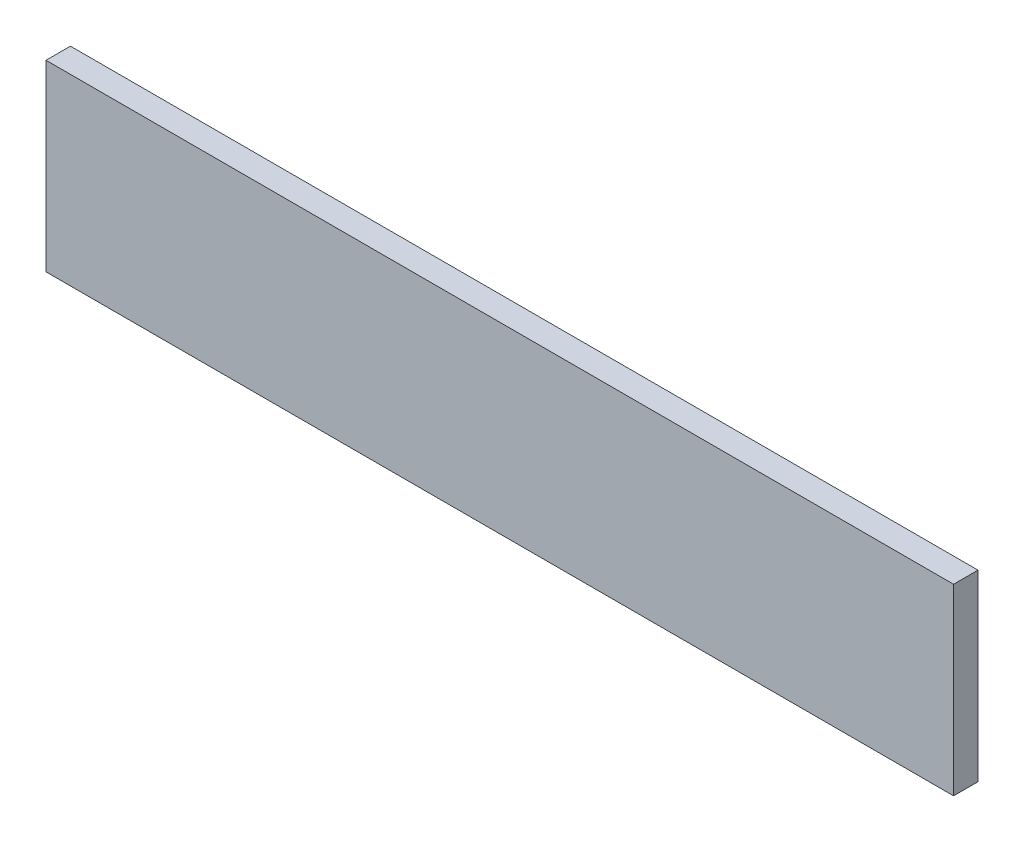
ISO-10303-21;
HEADER;
FILE_DESCRIPTION(('STEP AP214'),'2;1');
FILE_NAME('part.step','',(''),(''),'','','');
FILE_SCHEMA(('AUTOMOTIVE_DESIGN { 1 0 10303 214 1 1 1 1 }'));
ENDSEC;
DATA;
#1=APPLICATION_CONTEXT('core data for automotive mechanical design processes');
#2=APPLICATION_PROTOCOL_DEFINITION('international standard','automotive_design',2000,#1);
#3=PRODUCT_CONTEXT('',#1,'mechanical');
#4=PRODUCT('Part','Part','',(#3));
#5=PRODUCT_RELATED_PRODUCT_CATEGORY('part','',(#4));
#6=PRODUCT_DEFINITION_FORMATION('','',#4);
#7=PRODUCT_DEFINITION_CONTEXT('part definition',#1,'design');
#8=PRODUCT_DEFINITION('design','',#6,#7);
#9=PRODUCT_DEFINITION_SHAPE('','',#8);
#10=(LENGTH_UNIT() NAMED_UNIT(*) SI_UNIT(.MILLI.,.METRE.));
#11=(NAMED_UNIT(*) PLANE_ANGLE_UNIT() SI_UNIT($,.RADIAN.));
#12=(NAMED_UNIT(*) SI_UNIT($,.STERADIAN.) SOLID_ANGLE_UNIT());
#13=UNCERTAINTY_MEASURE_WITH_UNIT(LENGTH_MEASURE(1.E-05),#10,'distance_accuracy_value','');
#14=(GEOMETRIC_REPRESENTATION_CONTEXT(3) GLOBAL_UNCERTAINTY_ASSIGNED_CONTEXT((#13)) GLOBAL_UNIT_ASSIGNED_CONTEXT((#10,
#11,#12)) REPRESENTATION_CONTEXT('',''));
#15=CARTESIAN_POINT('',(0.,0.,0.));
#16=DIRECTION('',(0.,0.,1.));
#17=DIRECTION('',(1.,0.,0.));
#18=AXIS2_PLACEMENT_3D('',#15,#16,#17);
#19=CARTESIAN_POINT('',(0.,30.,4.));
#20=DIRECTION('',(1.,0.,0.));
#21=DIRECTION('',(0.,0.,-1.));
#22=AXIS2_PLACEMENT_3D('',#19,#20,#21);
#23=PLANE('',#22);
#24=DIRECTION('',(0.,-1.,0.));
#25=VECTOR('',#24,1.);
#26=CARTESIAN_POINT('',(0.,30.,0.));
#27=LINE('',#26,#25);
#28=CARTESIAN_POINT('',(0.,30.,0.));
#29=VERTEX_POINT('',#28);
#30=CARTESIAN_POINT('',(0.,0.,0.));
#31=VERTEX_POINT('',#30);
#32=EDGE_CURVE('E111',#29,#31,#27,.T.);
#33=ORIENTED_EDGE('',*,*,#32,.T.);
#34=DIRECTION('',(0.,0.,-1.));
#35=VECTOR('',#34,1.);
#36=CARTESIAN_POINT('',(0.,0.,4.));
#37=LINE('',#36,#35);
#38=CARTESIAN_POINT('',(0.,0.,4.));
#39=VERTEX_POINT('',#38);
#40=EDGE_CURVE('E11',#39,#31,#37,.T.);
#41=ORIENTED_EDGE('',*,*,#40,.F.);
#42=DIRECTION('',(0.,-1.,0.));
#43=VECTOR('',#42,1.);
#44=CARTESIAN_POINT('',(0.,30.,4.));
#45=LINE('',#44,#43);
#46=CARTESIAN_POINT('',(0.,30.,4.));
#47=VERTEX_POINT('',#46);
#48=EDGE_CURVE('E100',#47,#39,#45,.T.);
#49=ORIENTED_EDGE('',*,*,#48,.F.);
#50=DIRECTION('',(0.,0.,-1.));
#51=VECTOR('',#50,1.);
#52=CARTESIAN_POINT('',(0.,30.,4.));
#53=LINE('',#52,#51);
#54=EDGE_CURVE('E108',#47,#29,#53,.T.);
#55=ORIENTED_EDGE('',*,*,#54,.T.);
#56=EDGE_LOOP('',(#33,#41,#49,#55));
#57=FACE_BOUND('',#56,.T.);
#58=ADVANCED_FACE('F44',(#57),#23,.F.);
#59=CARTESIAN_POINT('',(0.,0.,4.));
#60=DIRECTION('',(0.,1.,0.));
#61=DIRECTION('',(0.,0.,1.));
#62=AXIS2_PLACEMENT_3D('',#59,#60,#61);
#63=PLANE('',#62);
#64=DIRECTION('',(1.,0.,0.));
#65=VECTOR('',#64,1.);
#66=CARTESIAN_POINT('',(0.,0.,0.));
#67=LINE('',#66,#65);
#68=CARTESIAN_POINT('',(148.57,0.,0.));
#69=VERTEX_POINT('',#68);
#70=EDGE_CURVE('E105',#31,#69,#67,.T.);
#71=ORIENTED_EDGE('',*,*,#70,.T.);
#72=DIRECTION('',(0.,0.,-1.));
#73=VECTOR('',#72,1.);
#74=CARTESIAN_POINT('',(148.57,0.,4.));
#75=LINE('',#74,#73);
#76=CARTESIAN_POINT('',(148.57,0.,4.));
#77=VERTEX_POINT('',#76);
#78=EDGE_CURVE('E53',#77,#69,#75,.T.);
#79=ORIENTED_EDGE('',*,*,#78,.F.);
#80=DIRECTION('',(1.,0.,0.));
#81=VECTOR('',#80,1.);
#82=CARTESIAN_POINT('',(0.,0.,4.));
#83=LINE('',#82,#81);
#84=EDGE_CURVE('E95',#39,#77,#83,.T.);
#85=ORIENTED_EDGE('',*,*,#84,.F.);
#86=ORIENTED_EDGE('',*,*,#40,.T.);
#87=EDGE_LOOP('',(#71,#79,#85,#86));
#88=FACE_BOUND('',#87,.T.);
#89=ADVANCED_FACE('F102',(#88),#63,.F.);
#90=CARTESIAN_POINT('',(148.57,0.,4.));
#91=DIRECTION('',(-1.,0.,0.));
#92=DIRECTION('',(0.,0.,1.));
#93=AXIS2_PLACEMENT_3D('',#90,#91,#92);
#94=PLANE('',#93);
#95=DIRECTION('',(0.,1.,0.));
#96=VECTOR('',#95,1.);
#97=CARTESIAN_POINT('',(148.57,0.,0.));
#98=LINE('',#97,#96);
#99=CARTESIAN_POINT('',(148.57,30.,0.));
#100=VERTEX_POINT('',#99);
#101=EDGE_CURVE('E80',#69,#100,#98,.T.);
#102=ORIENTED_EDGE('',*,*,#101,.T.);
#103=DIRECTION('',(0.,0.,-1.));
#104=VECTOR('',#103,1.);
#105=CARTESIAN_POINT('',(148.57,30.,4.));
#106=LINE('',#105,#104);
#107=CARTESIAN_POINT('',(148.57,30.,4.));
#108=VERTEX_POINT('',#107);
#109=EDGE_CURVE('E101',#108,#100,#106,.T.);
#110=ORIENTED_EDGE('',*,*,#109,.F.);
#111=DIRECTION('',(0.,1.,0.));
#112=VECTOR('',#111,1.);
#113=CARTESIAN_POINT('',(148.57,0.,4.));
#114=LINE('',#113,#112);
#115=EDGE_CURVE('E94',#77,#108,#114,.T.);
#116=ORIENTED_EDGE('',*,*,#115,.F.);
#117=ORIENTED_EDGE('',*,*,#78,.T.);
#118=EDGE_LOOP('',(#102,#110,#116,#117));
#119=FACE_BOUND('',#118,.T.);
#120=ADVANCED_FACE('F103',(#119),#94,.F.);
#121=CARTESIAN_POINT('',(148.57,30.,4.));
#122=DIRECTION('',(0.,-1.,0.));
#123=DIRECTION('',(0.,0.,-1.));
#124=AXIS2_PLACEMENT_3D('',#121,#122,#123);
#125=PLANE('',#124);
#126=DIRECTION('',(-1.,0.,0.));
#127=VECTOR('',#126,1.);
#128=CARTESIAN_POINT('',(148.57,30.,0.));
#129=LINE('',#128,#127);
#130=EDGE_CURVE('E82',#100,#29,#129,.T.);
#131=ORIENTED_EDGE('',*,*,#130,.T.);
#132=ORIENTED_EDGE('',*,*,#54,.F.);
#133=DIRECTION('',(-1.,0.,0.));
#134=VECTOR('',#133,1.);
#135=CARTESIAN_POINT('',(148.57,30.,4.));
#136=LINE('',#135,#134);
#137=EDGE_CURVE('E62',#108,#47,#136,.T.);
#138=ORIENTED_EDGE('',*,*,#137,.F.);
#139=ORIENTED_EDGE('',*,*,#109,.T.);
#140=EDGE_LOOP('',(#131,#132,#138,#139));
#141=FACE_BOUND('',#140,.T.);
#142=ADVANCED_FACE('F128',(#141),#125,.F.);
#143=CARTESIAN_POINT('',(0.,0.,4.));
#144=DIRECTION('',(0.,0.,1.));
#145=DIRECTION('',(1.,0.,0.));
#146=AXIS2_PLACEMENT_3D('',#143,#144,#145);
#147=PLANE('',#146);
#148=ORIENTED_EDGE('',*,*,#48,.T.);
#149=ORIENTED_EDGE('',*,*,#84,.T.);
#150=ORIENTED_EDGE('',*,*,#115,.T.);
#151=ORIENTED_EDGE('',*,*,#137,.T.);
#152=EDGE_LOOP('',(#148,#149,#150,#151));
#153=FACE_BOUND('',#152,.T.);
#154=ADVANCED_FACE('F93',(#153),#147,.T.);
#155=CARTESIAN_POINT('',(0.,0.,0.));
#156=DIRECTION('',(0.,0.,1.));
#157=DIRECTION('',(1.,0.,0.));
#158=AXIS2_PLACEMENT_3D('',#155,#156,#157);
#159=PLANE('',#158);
#160=ORIENTED_EDGE('',*,*,#32,.F.);
#161=ORIENTED_EDGE('',*,*,#130,.F.);
#162=ORIENTED_EDGE('',*,*,#101,.F.);
#163=ORIENTED_EDGE('',*,*,#70,.F.);
#164=EDGE_LOOP('',(#160,#161,#162,#163));
#165=FACE_BOUND('',#164,.T.);
#166=ADVANCED_FACE('F129',(#165),#159,.F.);
#167=CLOSED_SHELL('',(#58,#89,#120,#142,#154,#166));
#168=MANIFOLD_SOLID_BREP('B2',#167);
#169=ADVANCED_BREP_SHAPE_REPRESENTATION('',(#18,#168),#14);
#170=SHAPE_DEFINITION_REPRESENTATION(#9,#169);
ENDSEC;
END-ISO-10303-21;
